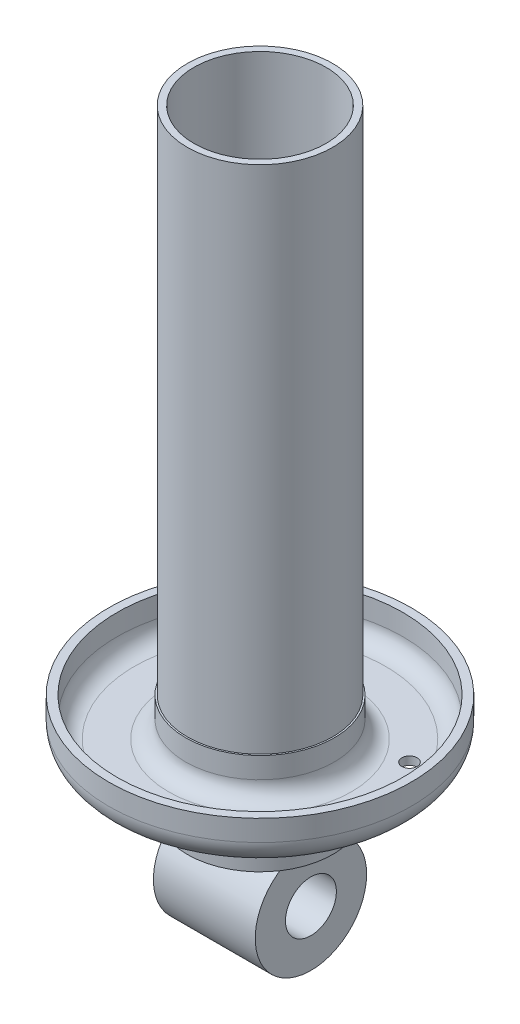
ISO-10303-21;
HEADER;
FILE_DESCRIPTION(('STEP AP214'),'2;1');
FILE_NAME('part.step','',(''),(''),'','','');
FILE_SCHEMA(('AUTOMOTIVE_DESIGN { 1 0 10303 214 1 1 1 1 }'));
ENDSEC;
DATA;
#1=APPLICATION_CONTEXT('core data for automotive mechanical design processes');
#2=APPLICATION_PROTOCOL_DEFINITION('international standard','automotive_design',2000,#1);
#3=PRODUCT_CONTEXT('',#1,'mechanical');
#4=PRODUCT('Part','Part','',(#3));
#5=PRODUCT_RELATED_PRODUCT_CATEGORY('part','',(#4));
#6=PRODUCT_DEFINITION_FORMATION('','',#4);
#7=PRODUCT_DEFINITION_CONTEXT('part definition',#1,'design');
#8=PRODUCT_DEFINITION('design','',#6,#7);
#9=PRODUCT_DEFINITION_SHAPE('','',#8);
#10=(LENGTH_UNIT() NAMED_UNIT(*) SI_UNIT(.MILLI.,.METRE.));
#11=(NAMED_UNIT(*) PLANE_ANGLE_UNIT() SI_UNIT($,.RADIAN.));
#12=(NAMED_UNIT(*) SI_UNIT($,.STERADIAN.) SOLID_ANGLE_UNIT());
#13=UNCERTAINTY_MEASURE_WITH_UNIT(LENGTH_MEASURE(1.E-05),#10,'distance_accuracy_value','');
#14=(GEOMETRIC_REPRESENTATION_CONTEXT(3) GLOBAL_UNCERTAINTY_ASSIGNED_CONTEXT((#13)) GLOBAL_UNIT_ASSIGNED_CONTEXT((#10,
#11,#12)) REPRESENTATION_CONTEXT('',''));
#15=CARTESIAN_POINT('',(0.,0.,0.));
#16=DIRECTION('',(0.,0.,1.));
#17=DIRECTION('',(1.,0.,0.));
#18=AXIS2_PLACEMENT_3D('',#15,#16,#17);
#19=CARTESIAN_POINT('',(16.,-34.9,0.));
#20=DIRECTION('',(1.,0.,0.));
#21=DIRECTION('',(0.,0.,-1.));
#22=AXIS2_PLACEMENT_3D('',#19,#20,#21);
#23=PLANE('',#22);
#24=CARTESIAN_POINT('',(16.,-34.9,0.));
#25=DIRECTION('',(1.,0.,0.));
#26=DIRECTION('',(0.,0.,-1.));
#27=AXIS2_PLACEMENT_3D('',#24,#25,#26);
#28=CIRCLE('',#27,17.5);
#29=CARTESIAN_POINT('',(16.,-34.9,-17.5));
#30=VERTEX_POINT('',#29);
#31=EDGE_CURVE('E11',#30,#30,#28,.T.);
#32=ORIENTED_EDGE('',*,*,#31,.T.);
#33=EDGE_LOOP('',(#32));
#34=FACE_BOUND('',#33,.T.);
#35=CARTESIAN_POINT('',(16.,-34.9,0.));
#36=DIRECTION('',(1.,0.,0.));
#37=DIRECTION('',(0.,0.,-1.));
#38=AXIS2_PLACEMENT_3D('',#35,#36,#37);
#39=CIRCLE('',#38,8.);
#40=CARTESIAN_POINT('',(16.,-34.9,-8.));
#41=VERTEX_POINT('',#40);
#42=EDGE_CURVE('E64',#41,#41,#39,.T.);
#43=ORIENTED_EDGE('',*,*,#42,.F.);
#44=EDGE_LOOP('',(#43));
#45=FACE_BOUND('',#44,.T.);
#46=ADVANCED_FACE('F53',(#34,#45),#23,.T.);
#47=CARTESIAN_POINT('',(-16.,-34.9,0.));
#48=DIRECTION('',(1.,0.,0.));
#49=DIRECTION('',(0.,0.,-1.));
#50=AXIS2_PLACEMENT_3D('',#47,#48,#49);
#51=PLANE('',#50);
#52=CARTESIAN_POINT('',(-16.,-34.9,0.));
#53=DIRECTION('',(1.,0.,0.));
#54=DIRECTION('',(0.,0.,-1.));
#55=AXIS2_PLACEMENT_3D('',#52,#53,#54);
#56=CIRCLE('',#55,17.5);
#57=CARTESIAN_POINT('',(-16.,-34.9,-17.5));
#58=VERTEX_POINT('',#57);
#59=EDGE_CURVE('E57',#58,#58,#56,.T.);
#60=ORIENTED_EDGE('',*,*,#59,.F.);
#61=EDGE_LOOP('',(#60));
#62=FACE_BOUND('',#61,.T.);
#63=CARTESIAN_POINT('',(-16.,-34.9,0.));
#64=DIRECTION('',(1.,0.,0.));
#65=DIRECTION('',(0.,0.,-1.));
#66=AXIS2_PLACEMENT_3D('',#63,#64,#65);
#67=CIRCLE('',#66,8.);
#68=CARTESIAN_POINT('',(-16.,-34.9,-8.));
#69=VERTEX_POINT('',#68);
#70=EDGE_CURVE('E66',#69,#69,#67,.T.);
#71=ORIENTED_EDGE('',*,*,#70,.T.);
#72=EDGE_LOOP('',(#71));
#73=FACE_BOUND('',#72,.T.);
#74=ADVANCED_FACE('F76',(#62,#73),#51,.F.);
#75=CARTESIAN_POINT('',(16.,-34.9,0.));
#76=DIRECTION('',(-1.,0.,0.));
#77=DIRECTION('',(0.,0.,1.));
#78=AXIS2_PLACEMENT_3D('',#75,#76,#77);
#79=CYLINDRICAL_SURFACE('',#78,17.5);
#80=ORIENTED_EDGE('',*,*,#31,.F.);
#81=EDGE_LOOP('',(#80));
#82=FACE_BOUND('',#81,.T.);
#83=ORIENTED_EDGE('',*,*,#59,.T.);
#84=EDGE_LOOP('',(#83));
#85=FACE_BOUND('',#84,.T.);
#86=ADVANCED_FACE('F55',(#82,#85),#79,.T.);
#87=CARTESIAN_POINT('',(16.,-34.9,0.));
#88=DIRECTION('',(-1.,0.,0.));
#89=DIRECTION('',(0.,0.,1.));
#90=AXIS2_PLACEMENT_3D('',#87,#88,#89);
#91=CYLINDRICAL_SURFACE('',#90,8.);
#92=ORIENTED_EDGE('',*,*,#42,.T.);
#93=EDGE_LOOP('',(#92));
#94=FACE_BOUND('',#93,.T.);
#95=ORIENTED_EDGE('',*,*,#70,.F.);
#96=EDGE_LOOP('',(#95));
#97=FACE_BOUND('',#96,.T.);
#98=ADVANCED_FACE('F72',(#94,#97),#91,.F.);
#99=CLOSED_SHELL('',(#46,#74,#86,#98));
#100=MANIFOLD_SOLID_BREP('B2',#99);
#101=CARTESIAN_POINT('',(0.,14.6,0.));
#102=DIRECTION('',(0.,1.,0.));
#103=DIRECTION('',(0.,0.,1.));
#104=AXIS2_PLACEMENT_3D('',#101,#102,#103);
#105=PLANE('',#104);
#106=CARTESIAN_POINT('',(0.,14.6,0.));
#107=DIRECTION('',(0.,1.,0.));
#108=DIRECTION('',(0.,0.,1.));
#109=AXIS2_PLACEMENT_3D('',#106,#107,#108);
#110=CIRCLE('',#109,47.5);
#111=CARTESIAN_POINT('',(0.,14.6,47.5));
#112=VERTEX_POINT('',#111);
#113=EDGE_CURVE('E155',#112,#112,#110,.T.);
#114=ORIENTED_EDGE('',*,*,#113,.T.);
#115=EDGE_LOOP('',(#114));
#116=FACE_BOUND('',#115,.T.);
#117=CARTESIAN_POINT('',(0.,14.6,0.));
#118=DIRECTION('',(0.,1.,0.));
#119=DIRECTION('',(0.,0.,1.));
#120=AXIS2_PLACEMENT_3D('',#117,#118,#119);
#121=CIRCLE('',#120,44.9);
#122=CARTESIAN_POINT('',(0.,14.6,44.9));
#123=VERTEX_POINT('',#122);
#124=EDGE_CURVE('E145',#123,#123,#121,.T.);
#125=ORIENTED_EDGE('',*,*,#124,.F.);
#126=EDGE_LOOP('',(#125));
#127=FACE_BOUND('',#126,.T.);
#128=ADVANCED_FACE('F115',(#116,#127),#105,.T.);
#129=CARTESIAN_POINT('',(0.,14.6,0.));
#130=DIRECTION('',(0.,1.,0.));
#131=DIRECTION('',(0.,0.,1.));
#132=AXIS2_PLACEMENT_3D('',#129,#130,#131);
#133=CIRCLE('',#132,22.85);
#134=CARTESIAN_POINT('',(0.,14.6,22.85));
#135=VERTEX_POINT('',#134);
#136=EDGE_CURVE('E154',#135,#135,#133,.T.);
#137=ORIENTED_EDGE('',*,*,#136,.F.);
#138=EDGE_LOOP('',(#137));
#139=FACE_BOUND('',#138,.T.);
#140=CARTESIAN_POINT('',(0.,14.6,0.));
#141=DIRECTION('',(0.,1.,0.));
#142=DIRECTION('',(0.,0.,1.));
#143=AXIS2_PLACEMENT_3D('',#140,#141,#142);
#144=CIRCLE('',#143,23.35);
#145=CARTESIAN_POINT('',(0.,14.6,23.35));
#146=VERTEX_POINT('',#145);
#147=EDGE_CURVE('E159',#146,#146,#144,.F.);
#148=ORIENTED_EDGE('',*,*,#147,.F.);
#149=EDGE_LOOP('',(#148));
#150=FACE_BOUND('',#149,.T.);
#151=ADVANCED_FACE('F226',(#139,#150),#105,.T.);
#152=CARTESIAN_POINT('',(0.,14.6,0.));
#153=DIRECTION('',(0.,-1.,0.));
#154=DIRECTION('',(0.,0.,-1.));
#155=AXIS2_PLACEMENT_3D('',#152,#153,#154);
#156=CYLINDRICAL_SURFACE('',#155,47.5);
#157=CARTESIAN_POINT('',(0.,8.,0.));
#158=DIRECTION('',(0.,1.,0.));
#159=DIRECTION('',(0.,0.,1.));
#160=AXIS2_PLACEMENT_3D('',#157,#158,#159);
#161=CIRCLE('',#160,47.5);
#162=CARTESIAN_POINT('',(0.,8.,47.5));
#163=VERTEX_POINT('',#162);
#164=EDGE_CURVE('E150',#163,#163,#161,.T.);
#165=ORIENTED_EDGE('',*,*,#164,.T.);
#166=EDGE_LOOP('',(#165));
#167=FACE_BOUND('',#166,.T.);
#168=ORIENTED_EDGE('',*,*,#113,.F.);
#169=EDGE_LOOP('',(#168));
#170=FACE_BOUND('',#169,.T.);
#171=ADVANCED_FACE('F233',(#167,#170),#156,.T.);
#172=CARTESIAN_POINT('',(0.,0.,0.));
#173=DIRECTION('',(0.,1.,0.));
#174=DIRECTION('',(0.,0.,1.));
#175=AXIS2_PLACEMENT_3D('',#172,#173,#174);
#176=PLANE('',#175);
#177=CARTESIAN_POINT('',(29.777642758065,0.,-17.1921300622015));
#178=DIRECTION('',(0.,-1.,0.));
#179=DIRECTION('',(-0.866025403784436,0.,0.500000000000004));
#180=AXIS2_PLACEMENT_3D('',#177,#178,#179);
#181=CIRCLE('',#180,2.4);
#182=CARTESIAN_POINT('',(27.6991817889824,0.,-15.9921300622015));
#183=VERTEX_POINT('',#182);
#184=EDGE_CURVE('E141',#183,#183,#181,.T.);
#185=ORIENTED_EDGE('',*,*,#184,.F.);
#186=EDGE_LOOP('',(#185));
#187=FACE_BOUND('',#186,.T.);
#188=CARTESIAN_POINT('',(-29.7776427580652,0.,-17.1921300622011));
#189=DIRECTION('',(0.,-1.,0.));
#190=DIRECTION('',(0.866025403784443,0.,0.499999999999992));
#191=AXIS2_PLACEMENT_3D('',#188,#189,#190);
#192=CIRCLE('',#191,2.4);
#193=CARTESIAN_POINT('',(-27.6991817889826,0.,-15.9921300622011));
#194=VERTEX_POINT('',#193);
#195=EDGE_CURVE('E188',#194,#194,#192,.T.);
#196=ORIENTED_EDGE('',*,*,#195,.F.);
#197=EDGE_LOOP('',(#196));
#198=FACE_BOUND('',#197,.T.);
#199=CARTESIAN_POINT('',(0.,0.,34.3842601244028));
#200=DIRECTION('',(0.,-1.,0.));
#201=DIRECTION('',(0.,0.,-1.));
#202=AXIS2_PLACEMENT_3D('',#199,#200,#201);
#203=CIRCLE('',#202,2.4);
#204=CARTESIAN_POINT('',(0.,0.,31.9842601244028));
#205=VERTEX_POINT('',#204);
#206=EDGE_CURVE('E136',#205,#205,#203,.T.);
#207=ORIENTED_EDGE('',*,*,#206,.F.);
#208=EDGE_LOOP('',(#207));
#209=FACE_BOUND('',#208,.T.);
#210=CARTESIAN_POINT('',(0.,0.,0.));
#211=DIRECTION('',(0.,1.,0.));
#212=DIRECTION('',(0.,0.,1.));
#213=AXIS2_PLACEMENT_3D('',#210,#211,#212);
#214=CIRCLE('',#213,28.75);
#215=CARTESIAN_POINT('',(0.,0.,28.75));
#216=VERTEX_POINT('',#215);
#217=EDGE_CURVE('E124',#216,#216,#214,.T.);
#218=ORIENTED_EDGE('',*,*,#217,.T.);
#219=EDGE_LOOP('',(#218));
#220=FACE_BOUND('',#219,.T.);
#221=CARTESIAN_POINT('',(0.,0.,0.));
#222=DIRECTION('',(0.,1.,0.));
#223=DIRECTION('',(0.,0.,1.));
#224=AXIS2_PLACEMENT_3D('',#221,#222,#223);
#225=CIRCLE('',#224,39.5);
#226=CARTESIAN_POINT('',(0.,0.,39.5));
#227=VERTEX_POINT('',#226);
#228=EDGE_CURVE('E129',#227,#227,#225,.F.);
#229=ORIENTED_EDGE('',*,*,#228,.T.);
#230=EDGE_LOOP('',(#229));
#231=FACE_BOUND('',#230,.T.);
#232=ADVANCED_FACE('F240',(#187,#198,#209,#220,#231),#176,.F.);
#233=CARTESIAN_POINT('',(0.,25.,0.));
#234=DIRECTION('',(0.,-1.,0.));
#235=DIRECTION('',(0.,0.,-1.));
#236=AXIS2_PLACEMENT_3D('',#233,#234,#235);
#237=CYLINDRICAL_SURFACE('',#236,22.85);
#238=ORIENTED_EDGE('',*,*,#136,.T.);
#239=EDGE_LOOP('',(#238));
#240=FACE_BOUND('',#239,.T.);
#241=CARTESIAN_POINT('',(0.,175.,0.));
#242=DIRECTION('',(0.,1.,0.));
#243=DIRECTION('',(0.,0.,1.));
#244=AXIS2_PLACEMENT_3D('',#241,#242,#243);
#245=CIRCLE('',#244,22.85);
#246=CARTESIAN_POINT('',(0.,175.,22.85));
#247=VERTEX_POINT('',#246);
#248=EDGE_CURVE('E192',#247,#247,#245,.T.);
#249=ORIENTED_EDGE('',*,*,#248,.F.);
#250=EDGE_LOOP('',(#249));
#251=FACE_BOUND('',#250,.T.);
#252=ADVANCED_FACE('F238',(#240,#251),#237,.T.);
#253=CARTESIAN_POINT('',(0.,0.,0.));
#254=DIRECTION('',(0.,1.,0.));
#255=DIRECTION('',(0.,0.,1.));
#256=AXIS2_PLACEMENT_3D('',#253,#254,#255);
#257=CYLINDRICAL_SURFACE('',#256,20.75);
#258=CARTESIAN_POINT('',(0.,14.6,0.));
#259=DIRECTION('',(0.,1.,0.));
#260=DIRECTION('',(0.,0.,1.));
#261=AXIS2_PLACEMENT_3D('',#258,#259,#260);
#262=CIRCLE('',#261,20.75);
#263=CARTESIAN_POINT('',(0.,14.6,20.75));
#264=VERTEX_POINT('',#263);
#265=EDGE_CURVE('E119',#264,#264,#262,.F.);
#266=ORIENTED_EDGE('',*,*,#265,.T.);
#267=EDGE_LOOP('',(#266));
#268=FACE_BOUND('',#267,.T.);
#269=CARTESIAN_POINT('',(0.,175.,0.));
#270=DIRECTION('',(0.,1.,0.));
#271=DIRECTION('',(0.,0.,1.));
#272=AXIS2_PLACEMENT_3D('',#269,#270,#271);
#273=CIRCLE('',#272,20.75);
#274=CARTESIAN_POINT('',(0.,175.,20.75));
#275=VERTEX_POINT('',#274);
#276=EDGE_CURVE('E199',#275,#275,#273,.T.);
#277=ORIENTED_EDGE('',*,*,#276,.T.);
#278=EDGE_LOOP('',(#277));
#279=FACE_BOUND('',#278,.T.);
#280=ADVANCED_FACE('F212',(#268,#279),#257,.F.);
#281=CARTESIAN_POINT('',(0.,8.,0.));
#282=DIRECTION('',(0.,1.,0.));
#283=DIRECTION('',(0.,0.,1.));
#284=AXIS2_PLACEMENT_3D('',#281,#282,#283);
#285=TOROIDAL_SURFACE('',#284,39.5,8.);
#286=ORIENTED_EDGE('',*,*,#228,.F.);
#287=EDGE_LOOP('',(#286));
#288=FACE_BOUND('',#287,.T.);
#289=ORIENTED_EDGE('',*,*,#164,.F.);
#290=EDGE_LOOP('',(#289));
#291=FACE_BOUND('',#290,.T.);
#292=ADVANCED_FACE('F246',(#288,#291),#285,.T.);
#293=CARTESIAN_POINT('',(0.,8.,0.));
#294=DIRECTION('',(0.,1.,0.));
#295=DIRECTION('',(0.,0.,1.));
#296=AXIS2_PLACEMENT_3D('',#293,#294,#295);
#297=TOROIDAL_SURFACE('',#296,28.75,8.);
#298=CARTESIAN_POINT('',(0.,2.59722293630396,0.));
#299=DIRECTION('',(0.,1.,0.));
#300=DIRECTION('',(0.,0.,1.));
#301=AXIS2_PLACEMENT_3D('',#298,#299,#300);
#302=CIRCLE('',#301,22.85);
#303=CARTESIAN_POINT('',(0.,2.59722293630396,22.85));
#304=VERTEX_POINT('',#303);
#305=EDGE_CURVE('E52',#304,#304,#302,.F.);
#306=ORIENTED_EDGE('',*,*,#305,.F.);
#307=EDGE_LOOP('',(#306));
#308=FACE_BOUND('',#307,.T.);
#309=ORIENTED_EDGE('',*,*,#217,.F.);
#310=EDGE_LOOP('',(#309));
#311=FACE_BOUND('',#310,.T.);
#312=ADVANCED_FACE('F117',(#308,#311),#297,.T.);
#313=CARTESIAN_POINT('',(0.,14.6,0.));
#314=DIRECTION('',(0.,-1.,0.));
#315=DIRECTION('',(0.,0.,-1.));
#316=AXIS2_PLACEMENT_3D('',#313,#314,#315);
#317=CYLINDRICAL_SURFACE('',#316,44.9);
#318=CARTESIAN_POINT('',(0.,8.,0.));
#319=DIRECTION('',(0.,-1.,0.));
#320=DIRECTION('',(0.,0.,-1.));
#321=AXIS2_PLACEMENT_3D('',#318,#319,#320);
#322=CIRCLE('',#321,44.9);
#323=CARTESIAN_POINT('',(0.,8.,-44.9));
#324=VERTEX_POINT('',#323);
#325=EDGE_CURVE('E170',#324,#324,#322,.F.);
#326=ORIENTED_EDGE('',*,*,#325,.F.);
#327=EDGE_LOOP('',(#326));
#328=FACE_BOUND('',#327,.T.);
#329=ORIENTED_EDGE('',*,*,#124,.T.);
#330=EDGE_LOOP('',(#329));
#331=FACE_BOUND('',#330,.T.);
#332=ADVANCED_FACE('F251',(#328,#331),#317,.F.);
#333=CARTESIAN_POINT('',(0.,2.6,0.));
#334=DIRECTION('',(0.,1.,0.));
#335=DIRECTION('',(0.,0.,1.));
#336=AXIS2_PLACEMENT_3D('',#333,#334,#335);
#337=PLANE('',#336);
#338=CARTESIAN_POINT('',(29.777642758065,2.6,-17.1921300622015));
#339=DIRECTION('',(0.,1.,0.));
#340=DIRECTION('',(0.,0.,1.));
#341=AXIS2_PLACEMENT_3D('',#338,#339,#340);
#342=CIRCLE('',#341,2.4);
#343=CARTESIAN_POINT('',(29.777642758065,2.6,-14.7921300622015));
#344=VERTEX_POINT('',#343);
#345=EDGE_CURVE('E132',#344,#344,#342,.T.);
#346=ORIENTED_EDGE('',*,*,#345,.F.);
#347=EDGE_LOOP('',(#346));
#348=FACE_BOUND('',#347,.T.);
#349=CARTESIAN_POINT('',(-29.7776427580652,2.6,-17.1921300622011));
#350=DIRECTION('',(0.,1.,0.));
#351=DIRECTION('',(0.,0.,1.));
#352=AXIS2_PLACEMENT_3D('',#349,#350,#351);
#353=CIRCLE('',#352,2.4);
#354=CARTESIAN_POINT('',(-29.7776427580652,2.6,-14.7921300622011));
#355=VERTEX_POINT('',#354);
#356=EDGE_CURVE('E137',#355,#355,#353,.T.);
#357=ORIENTED_EDGE('',*,*,#356,.F.);
#358=EDGE_LOOP('',(#357));
#359=FACE_BOUND('',#358,.T.);
#360=CARTESIAN_POINT('',(0.,2.6,34.3842601244028));
#361=DIRECTION('',(0.,1.,0.));
#362=DIRECTION('',(0.,0.,1.));
#363=AXIS2_PLACEMENT_3D('',#360,#361,#362);
#364=CIRCLE('',#363,2.4);
#365=CARTESIAN_POINT('',(0.,2.6,36.7842601244028));
#366=VERTEX_POINT('',#365);
#367=EDGE_CURVE('E142',#366,#366,#364,.T.);
#368=ORIENTED_EDGE('',*,*,#367,.F.);
#369=EDGE_LOOP('',(#368));
#370=FACE_BOUND('',#369,.T.);
#371=CARTESIAN_POINT('',(0.,2.6,0.));
#372=DIRECTION('',(0.,1.,0.));
#373=DIRECTION('',(0.,0.,1.));
#374=AXIS2_PLACEMENT_3D('',#371,#372,#373);
#375=CIRCLE('',#374,28.75);
#376=CARTESIAN_POINT('',(0.,2.6,28.75));
#377=VERTEX_POINT('',#376);
#378=EDGE_CURVE('E174',#377,#377,#375,.T.);
#379=ORIENTED_EDGE('',*,*,#378,.F.);
#380=EDGE_LOOP('',(#379));
#381=FACE_BOUND('',#380,.T.);
#382=CARTESIAN_POINT('',(0.,2.6,0.));
#383=DIRECTION('',(0.,1.,0.));
#384=DIRECTION('',(0.,0.,1.));
#385=AXIS2_PLACEMENT_3D('',#382,#383,#384);
#386=CIRCLE('',#385,39.5);
#387=CARTESIAN_POINT('',(0.,2.6,39.5));
#388=VERTEX_POINT('',#387);
#389=EDGE_CURVE('E178',#388,#388,#386,.F.);
#390=ORIENTED_EDGE('',*,*,#389,.F.);
#391=EDGE_LOOP('',(#390));
#392=FACE_BOUND('',#391,.T.);
#393=ADVANCED_FACE('F278',(#348,#359,#370,#381,#392),#337,.T.);
#394=CARTESIAN_POINT('',(0.,0.,0.));
#395=DIRECTION('',(0.,1.,0.));
#396=DIRECTION('',(0.,0.,1.));
#397=AXIS2_PLACEMENT_3D('',#394,#395,#396);
#398=CYLINDRICAL_SURFACE('',#397,23.35);
#399=ORIENTED_EDGE('',*,*,#147,.T.);
#400=EDGE_LOOP('',(#399));
#401=FACE_BOUND('',#400,.T.);
#402=CARTESIAN_POINT('',(0.,8.,0.));
#403=DIRECTION('',(0.,1.,0.));
#404=DIRECTION('',(0.,0.,1.));
#405=AXIS2_PLACEMENT_3D('',#402,#403,#404);
#406=CIRCLE('',#405,23.35);
#407=CARTESIAN_POINT('',(0.,8.,23.35));
#408=VERTEX_POINT('',#407);
#409=EDGE_CURVE('E166',#408,#408,#406,.F.);
#410=ORIENTED_EDGE('',*,*,#409,.F.);
#411=EDGE_LOOP('',(#410));
#412=FACE_BOUND('',#411,.T.);
#413=ADVANCED_FACE('F274',(#401,#412),#398,.T.);
#414=CARTESIAN_POINT('',(0.,8.,0.));
#415=DIRECTION('',(0.,1.,0.));
#416=DIRECTION('',(0.,0.,1.));
#417=AXIS2_PLACEMENT_3D('',#414,#415,#416);
#418=TOROIDAL_SURFACE('',#417,39.5,5.4);
#419=ORIENTED_EDGE('',*,*,#389,.T.);
#420=EDGE_LOOP('',(#419));
#421=FACE_BOUND('',#420,.T.);
#422=ORIENTED_EDGE('',*,*,#325,.T.);
#423=EDGE_LOOP('',(#422));
#424=FACE_BOUND('',#423,.T.);
#425=ADVANCED_FACE('F270',(#421,#424),#418,.F.);
#426=CARTESIAN_POINT('',(0.,8.,0.));
#427=DIRECTION('',(0.,1.,0.));
#428=DIRECTION('',(0.,0.,1.));
#429=AXIS2_PLACEMENT_3D('',#426,#427,#428);
#430=TOROIDAL_SURFACE('',#429,28.75,5.4);
#431=ORIENTED_EDGE('',*,*,#409,.T.);
#432=EDGE_LOOP('',(#431));
#433=FACE_BOUND('',#432,.T.);
#434=ORIENTED_EDGE('',*,*,#378,.T.);
#435=EDGE_LOOP('',(#434));
#436=FACE_BOUND('',#435,.T.);
#437=ADVANCED_FACE('F266',(#433,#436),#430,.F.);
#438=CARTESIAN_POINT('',(0.,25.,34.3842601244028));
#439=DIRECTION('',(0.,-1.,0.));
#440=DIRECTION('',(0.,0.,-1.));
#441=AXIS2_PLACEMENT_3D('',#438,#439,#440);
#442=CYLINDRICAL_SURFACE('',#441,2.4);
#443=ORIENTED_EDGE('',*,*,#367,.T.);
#444=EDGE_LOOP('',(#443));
#445=FACE_BOUND('',#444,.T.);
#446=ORIENTED_EDGE('',*,*,#206,.T.);
#447=EDGE_LOOP('',(#446));
#448=FACE_BOUND('',#447,.T.);
#449=ADVANCED_FACE('F269',(#445,#448),#442,.F.);
#450=CARTESIAN_POINT('',(-29.7776427580652,25.,-17.1921300622011));
#451=DIRECTION('',(0.,-1.,0.));
#452=DIRECTION('',(0.,0.,-1.));
#453=AXIS2_PLACEMENT_3D('',#450,#451,#452);
#454=CYLINDRICAL_SURFACE('',#453,2.4);
#455=ORIENTED_EDGE('',*,*,#356,.T.);
#456=EDGE_LOOP('',(#455));
#457=FACE_BOUND('',#456,.T.);
#458=ORIENTED_EDGE('',*,*,#195,.T.);
#459=EDGE_LOOP('',(#458));
#460=FACE_BOUND('',#459,.T.);
#461=ADVANCED_FACE('F288',(#457,#460),#454,.F.);
#462=CARTESIAN_POINT('',(29.777642758065,25.,-17.1921300622015));
#463=DIRECTION('',(0.,-1.,0.));
#464=DIRECTION('',(0.,0.,-1.));
#465=AXIS2_PLACEMENT_3D('',#462,#463,#464);
#466=CYLINDRICAL_SURFACE('',#465,2.4);
#467=ORIENTED_EDGE('',*,*,#345,.T.);
#468=EDGE_LOOP('',(#467));
#469=FACE_BOUND('',#468,.T.);
#470=ORIENTED_EDGE('',*,*,#184,.T.);
#471=EDGE_LOOP('',(#470));
#472=FACE_BOUND('',#471,.T.);
#473=ADVANCED_FACE('F292',(#469,#472),#466,.F.);
#474=CARTESIAN_POINT('',(0.,175.,0.));
#475=DIRECTION('',(0.,1.,0.));
#476=DIRECTION('',(0.,0.,1.));
#477=AXIS2_PLACEMENT_3D('',#474,#475,#476);
#478=PLANE('',#477);
#479=ORIENTED_EDGE('',*,*,#248,.T.);
#480=EDGE_LOOP('',(#479));
#481=FACE_BOUND('',#480,.T.);
#482=ORIENTED_EDGE('',*,*,#276,.F.);
#483=EDGE_LOOP('',(#482));
#484=FACE_BOUND('',#483,.T.);
#485=ADVANCED_FACE('F296',(#481,#484),#478,.T.);
#486=CARTESIAN_POINT('',(0.,-17.4,0.));
#487=DIRECTION('',(0.,1.,0.));
#488=DIRECTION('',(0.,0.,1.));
#489=AXIS2_PLACEMENT_3D('',#486,#487,#488);
#490=PLANE('',#489);
#491=CARTESIAN_POINT('',(0.,-17.4,0.));
#492=DIRECTION('',(0.,1.,0.));
#493=DIRECTION('',(0.,0.,1.));
#494=AXIS2_PLACEMENT_3D('',#491,#492,#493);
#495=CIRCLE('',#494,22.85);
#496=CARTESIAN_POINT('',(0.,-17.4,22.85));
#497=VERTEX_POINT('',#496);
#498=EDGE_CURVE('E203',#497,#497,#495,.T.);
#499=ORIENTED_EDGE('',*,*,#498,.F.);
#500=EDGE_LOOP('',(#499));
#501=FACE_BOUND('',#500,.T.);
#502=ADVANCED_FACE('F222',(#501),#490,.F.);
#503=CARTESIAN_POINT('',(0.,-17.4,0.));
#504=DIRECTION('',(0.,1.,0.));
#505=DIRECTION('',(0.,0.,1.));
#506=AXIS2_PLACEMENT_3D('',#503,#504,#505);
#507=CYLINDRICAL_SURFACE('',#506,22.85);
#508=ORIENTED_EDGE('',*,*,#305,.T.);
#509=EDGE_LOOP('',(#508));
#510=FACE_BOUND('',#509,.T.);
#511=ORIENTED_EDGE('',*,*,#498,.T.);
#512=EDGE_LOOP('',(#511));
#513=FACE_BOUND('',#512,.T.);
#514=ADVANCED_FACE('F217',(#510,#513),#507,.T.);
#515=CARTESIAN_POINT('',(0.,14.6,0.));
#516=DIRECTION('',(0.,1.,0.));
#517=DIRECTION('',(0.,0.,1.));
#518=AXIS2_PLACEMENT_3D('',#515,#516,#517);
#519=PLANE('',#518);
#520=ORIENTED_EDGE('',*,*,#265,.F.);
#521=EDGE_LOOP('',(#520));
#522=FACE_BOUND('',#521,.T.);
#523=ADVANCED_FACE('F215',(#522),#519,.T.);
#524=CLOSED_SHELL('',(#128,#151,#171,#232,#252,#280,#292,#312,#332,#393,#413,#425,#437,#449,
#461,#473,#485,#502,#514,#523));
#525=MANIFOLD_SOLID_BREP('B6',#524);
#526=ADVANCED_BREP_SHAPE_REPRESENTATION('',(#18,#100,#525),#14);
#527=SHAPE_DEFINITION_REPRESENTATION(#9,#526);
ENDSEC;
END-ISO-10303-21;
